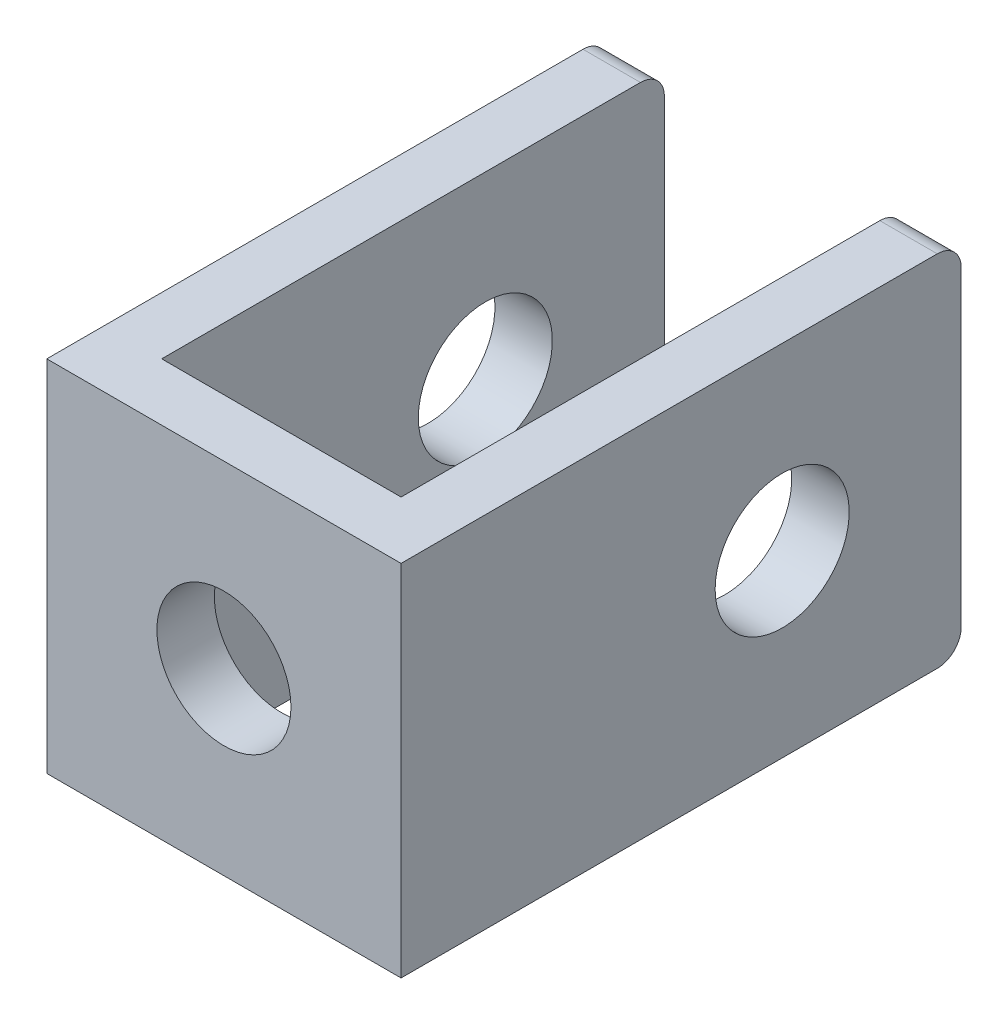
ISO-10303-21;
HEADER;
FILE_DESCRIPTION(('STEP AP214'),'2;1');
FILE_NAME('part.step','',(''),(''),'','','');
FILE_SCHEMA(('AUTOMOTIVE_DESIGN { 1 0 10303 214 1 1 1 1 }'));
ENDSEC;
DATA;
#1=APPLICATION_CONTEXT('core data for automotive mechanical design processes');
#2=APPLICATION_PROTOCOL_DEFINITION('international standard','automotive_design',2000,#1);
#3=PRODUCT_CONTEXT('',#1,'mechanical');
#4=PRODUCT('Part','Part','',(#3));
#5=PRODUCT_RELATED_PRODUCT_CATEGORY('part','',(#4));
#6=PRODUCT_DEFINITION_FORMATION('','',#4);
#7=PRODUCT_DEFINITION_CONTEXT('part definition',#1,'design');
#8=PRODUCT_DEFINITION('design','',#6,#7);
#9=PRODUCT_DEFINITION_SHAPE('','',#8);
#10=(LENGTH_UNIT() NAMED_UNIT(*) SI_UNIT(.MILLI.,.METRE.));
#11=(NAMED_UNIT(*) PLANE_ANGLE_UNIT() SI_UNIT($,.RADIAN.));
#12=(NAMED_UNIT(*) SI_UNIT($,.STERADIAN.) SOLID_ANGLE_UNIT());
#13=UNCERTAINTY_MEASURE_WITH_UNIT(LENGTH_MEASURE(1.E-05),#10,'distance_accuracy_value','');
#14=(GEOMETRIC_REPRESENTATION_CONTEXT(3) GLOBAL_UNCERTAINTY_ASSIGNED_CONTEXT((#13)) GLOBAL_UNIT_ASSIGNED_CONTEXT((#10,
#11,#12)) REPRESENTATION_CONTEXT('',''));
#15=CARTESIAN_POINT('',(0.,0.,0.));
#16=DIRECTION('',(0.,0.,1.));
#17=DIRECTION('',(1.,0.,0.));
#18=AXIS2_PLACEMENT_3D('',#15,#16,#17);
#19=CARTESIAN_POINT('',(-4.699,0.,-7.4295));
#20=DIRECTION('',(0.,0.,-1.));
#21=DIRECTION('',(-1.,0.,0.));
#22=AXIS2_PLACEMENT_3D('',#19,#20,#21);
#23=PLANE('',#22);
#24=DIRECTION('',(0.,-1.,0.));
#25=VECTOR('',#24,1.);
#26=CARTESIAN_POINT('',(-3.175,9.525,-7.4295));
#27=LINE('',#26,#25);
#28=CARTESIAN_POINT('',(-3.175,8.89,-7.4295));
#29=VERTEX_POINT('',#28);
#30=CARTESIAN_POINT('',(-3.175,0.635000000000004,-7.4295));
#31=VERTEX_POINT('',#30);
#32=EDGE_CURVE('E148',#29,#31,#27,.T.);
#33=ORIENTED_EDGE('',*,*,#32,.T.);
#34=DIRECTION('',(1.,0.,0.));
#35=VECTOR('',#34,1.);
#36=CARTESIAN_POINT('',(-4.699,0.635,-7.4295));
#37=LINE('',#36,#35);
#38=CARTESIAN_POINT('',(-4.699,0.635,-7.4295));
#39=VERTEX_POINT('',#38);
#40=EDGE_CURVE('E202',#31,#39,#37,.F.);
#41=ORIENTED_EDGE('',*,*,#40,.T.);
#42=DIRECTION('',(0.,1.,0.));
#43=VECTOR('',#42,1.);
#44=CARTESIAN_POINT('',(-4.699,0.,-7.4295));
#45=LINE('',#44,#43);
#46=CARTESIAN_POINT('',(-4.699,8.89,-7.4295));
#47=VERTEX_POINT('',#46);
#48=EDGE_CURVE('E172',#39,#47,#45,.T.);
#49=ORIENTED_EDGE('',*,*,#48,.T.);
#50=DIRECTION('',(1.,0.,0.));
#51=VECTOR('',#50,1.);
#52=CARTESIAN_POINT('',(-4.699,8.89,-7.4295));
#53=LINE('',#52,#51);
#54=EDGE_CURVE('E199',#47,#29,#53,.T.);
#55=ORIENTED_EDGE('',*,*,#54,.T.);
#56=EDGE_LOOP('',(#33,#41,#49,#55));
#57=FACE_BOUND('',#56,.T.);
#58=ADVANCED_FACE('F33',(#57),#23,.T.);
#59=CARTESIAN_POINT('',(-4.699,9.525,7.4295));
#60=DIRECTION('',(0.,0.,1.));
#61=DIRECTION('',(1.,0.,0.));
#62=AXIS2_PLACEMENT_3D('',#59,#60,#61);
#63=PLANE('',#62);
#64=CARTESIAN_POINT('',(0.,4.7625,7.4295));
#65=DIRECTION('',(0.,0.,1.));
#66=DIRECTION('',(1.,0.,0.));
#67=AXIS2_PLACEMENT_3D('',#64,#65,#66);
#68=CIRCLE('',#67,1.77799999999998);
#69=CARTESIAN_POINT('',(1.77799999999998,4.7625,7.4295));
#70=VERTEX_POINT('',#69);
#71=EDGE_CURVE('E300',#70,#70,#68,.T.);
#72=ORIENTED_EDGE('',*,*,#71,.F.);
#73=EDGE_LOOP('',(#72));
#74=FACE_BOUND('',#73,.T.);
#75=DIRECTION('',(0.,-1.,0.));
#76=VECTOR('',#75,1.);
#77=CARTESIAN_POINT('',(4.699,9.525,7.4295));
#78=LINE('',#77,#76);
#79=CARTESIAN_POINT('',(4.699,9.525,7.4295));
#80=VERTEX_POINT('',#79);
#81=CARTESIAN_POINT('',(4.699,0.,7.4295));
#82=VERTEX_POINT('',#81);
#83=EDGE_CURVE('E161',#80,#82,#78,.T.);
#84=ORIENTED_EDGE('',*,*,#83,.F.);
#85=DIRECTION('',(1.,0.,0.));
#86=VECTOR('',#85,1.);
#87=CARTESIAN_POINT('',(-4.699,9.525,7.4295));
#88=LINE('',#87,#86);
#89=CARTESIAN_POINT('',(-4.699,9.525,7.4295));
#90=VERTEX_POINT('',#89);
#91=EDGE_CURVE('E185',#90,#80,#88,.T.);
#92=ORIENTED_EDGE('',*,*,#91,.F.);
#93=DIRECTION('',(0.,-1.,0.));
#94=VECTOR('',#93,1.);
#95=CARTESIAN_POINT('',(-4.699,9.525,7.4295));
#96=LINE('',#95,#94);
#97=CARTESIAN_POINT('',(-4.699,0.,7.4295));
#98=VERTEX_POINT('',#97);
#99=EDGE_CURVE('E165',#90,#98,#96,.T.);
#100=ORIENTED_EDGE('',*,*,#99,.T.);
#101=DIRECTION('',(1.,0.,0.));
#102=VECTOR('',#101,1.);
#103=CARTESIAN_POINT('',(-4.699,0.,7.4295));
#104=LINE('',#103,#102);
#105=EDGE_CURVE('E177',#98,#82,#104,.T.);
#106=ORIENTED_EDGE('',*,*,#105,.T.);
#107=EDGE_LOOP('',(#84,#92,#100,#106));
#108=FACE_BOUND('',#107,.T.);
#109=ADVANCED_FACE('F241',(#74,#108),#63,.T.);
#110=CARTESIAN_POINT('',(-4.699,9.525,-7.4295));
#111=DIRECTION('',(0.,1.,0.));
#112=DIRECTION('',(0.,0.,1.));
#113=AXIS2_PLACEMENT_3D('',#110,#111,#112);
#114=PLANE('',#113);
#115=DIRECTION('',(0.,0.,-1.));
#116=VECTOR('',#115,1.);
#117=CARTESIAN_POINT('',(-3.175,9.525,5.9055));
#118=LINE('',#117,#116);
#119=CARTESIAN_POINT('',(-3.175,9.525,5.9055));
#120=VERTEX_POINT('',#119);
#121=CARTESIAN_POINT('',(-3.175,9.525,-6.7945));
#122=VERTEX_POINT('',#121);
#123=EDGE_CURVE('E133',#120,#122,#118,.T.);
#124=ORIENTED_EDGE('',*,*,#123,.T.);
#125=DIRECTION('',(1.,0.,0.));
#126=VECTOR('',#125,1.);
#127=CARTESIAN_POINT('',(-4.699,9.525,-6.7945));
#128=LINE('',#127,#126);
#129=CARTESIAN_POINT('',(-4.699,9.525,-6.7945));
#130=VERTEX_POINT('',#129);
#131=EDGE_CURVE('E209',#122,#130,#128,.F.);
#132=ORIENTED_EDGE('',*,*,#131,.T.);
#133=DIRECTION('',(0.,0.,1.));
#134=VECTOR('',#133,1.);
#135=CARTESIAN_POINT('',(-4.699,9.525,-7.4295));
#136=LINE('',#135,#134);
#137=EDGE_CURVE('E175',#130,#90,#136,.T.);
#138=ORIENTED_EDGE('',*,*,#137,.T.);
#139=ORIENTED_EDGE('',*,*,#91,.T.);
#140=DIRECTION('',(0.,0.,1.));
#141=VECTOR('',#140,1.);
#142=CARTESIAN_POINT('',(4.699,9.525,-7.4295));
#143=LINE('',#142,#141);
#144=CARTESIAN_POINT('',(4.699,9.525,-6.7945));
#145=VERTEX_POINT('',#144);
#146=EDGE_CURVE('E169',#145,#80,#143,.T.);
#147=ORIENTED_EDGE('',*,*,#146,.F.);
#148=DIRECTION('',(1.,0.,0.));
#149=VECTOR('',#148,1.);
#150=CARTESIAN_POINT('',(-4.699,9.525,-6.7945));
#151=LINE('',#150,#149);
#152=CARTESIAN_POINT('',(3.175,9.525,-6.7945));
#153=VERTEX_POINT('',#152);
#154=EDGE_CURVE('E130',#145,#153,#151,.F.);
#155=ORIENTED_EDGE('',*,*,#154,.T.);
#156=DIRECTION('',(0.,0.,1.));
#157=VECTOR('',#156,1.);
#158=CARTESIAN_POINT('',(3.175,9.525,-7.4295));
#159=LINE('',#158,#157);
#160=CARTESIAN_POINT('',(3.175,9.525,5.9055));
#161=VERTEX_POINT('',#160);
#162=EDGE_CURVE('E123',#153,#161,#159,.T.);
#163=ORIENTED_EDGE('',*,*,#162,.T.);
#164=DIRECTION('',(-1.,0.,0.));
#165=VECTOR('',#164,1.);
#166=CARTESIAN_POINT('',(3.175,9.525,5.9055));
#167=LINE('',#166,#165);
#168=EDGE_CURVE('E128',#161,#120,#167,.T.);
#169=ORIENTED_EDGE('',*,*,#168,.T.);
#170=EDGE_LOOP('',(#124,#132,#138,#139,#147,#155,#163,#169));
#171=FACE_BOUND('',#170,.T.);
#172=ADVANCED_FACE('F126',(#171),#114,.T.);
#173=DIRECTION('',(0.,-1.,0.));
#174=VECTOR('',#173,1.);
#175=CARTESIAN_POINT('',(3.175,9.525,-7.4295));
#176=LINE('',#175,#174);
#177=CARTESIAN_POINT('',(3.175,8.89,-7.4295));
#178=VERTEX_POINT('',#177);
#179=CARTESIAN_POINT('',(3.175,0.635000000000004,-7.4295));
#180=VERTEX_POINT('',#179);
#181=EDGE_CURVE('E144',#178,#180,#176,.T.);
#182=ORIENTED_EDGE('',*,*,#181,.F.);
#183=DIRECTION('',(1.,0.,0.));
#184=VECTOR('',#183,1.);
#185=CARTESIAN_POINT('',(-4.699,8.89,-7.4295));
#186=LINE('',#185,#184);
#187=CARTESIAN_POINT('',(4.699,8.89,-7.4295));
#188=VERTEX_POINT('',#187);
#189=EDGE_CURVE('E213',#178,#188,#186,.T.);
#190=ORIENTED_EDGE('',*,*,#189,.T.);
#191=DIRECTION('',(0.,1.,0.));
#192=VECTOR('',#191,1.);
#193=CARTESIAN_POINT('',(4.699,0.,-7.4295));
#194=LINE('',#193,#192);
#195=CARTESIAN_POINT('',(4.699,0.635,-7.4295));
#196=VERTEX_POINT('',#195);
#197=EDGE_CURVE('E182',#196,#188,#194,.T.);
#198=ORIENTED_EDGE('',*,*,#197,.F.);
#199=DIRECTION('',(1.,0.,0.));
#200=VECTOR('',#199,1.);
#201=CARTESIAN_POINT('',(-4.699,0.635,-7.4295));
#202=LINE('',#201,#200);
#203=EDGE_CURVE('E211',#196,#180,#202,.F.);
#204=ORIENTED_EDGE('',*,*,#203,.T.);
#205=EDGE_LOOP('',(#182,#190,#198,#204));
#206=FACE_BOUND('',#205,.T.);
#207=ADVANCED_FACE('F226',(#206),#23,.T.);
#208=CARTESIAN_POINT('',(-4.699,0.,7.4295));
#209=DIRECTION('',(0.,-1.,0.));
#210=DIRECTION('',(0.,0.,-1.));
#211=AXIS2_PLACEMENT_3D('',#208,#209,#210);
#212=PLANE('',#211);
#213=DIRECTION('',(0.,0.,-1.));
#214=VECTOR('',#213,1.);
#215=CARTESIAN_POINT('',(-4.699,0.,7.4295));
#216=LINE('',#215,#214);
#217=CARTESIAN_POINT('',(-4.699,0.,-6.7945));
#218=VERTEX_POINT('',#217);
#219=EDGE_CURVE('E168',#98,#218,#216,.T.);
#220=ORIENTED_EDGE('',*,*,#219,.T.);
#221=DIRECTION('',(1.,0.,0.));
#222=VECTOR('',#221,1.);
#223=CARTESIAN_POINT('',(-4.699,0.,-6.7945));
#224=LINE('',#223,#222);
#225=CARTESIAN_POINT('',(-3.175,0.,-6.7945));
#226=VERTEX_POINT('',#225);
#227=EDGE_CURVE('E192',#218,#226,#224,.T.);
#228=ORIENTED_EDGE('',*,*,#227,.T.);
#229=DIRECTION('',(0.,0.,-1.));
#230=VECTOR('',#229,1.);
#231=CARTESIAN_POINT('',(-3.175,0.,5.9055));
#232=LINE('',#231,#230);
#233=CARTESIAN_POINT('',(-3.175,0.,5.9055));
#234=VERTEX_POINT('',#233);
#235=EDGE_CURVE('E154',#234,#226,#232,.T.);
#236=ORIENTED_EDGE('',*,*,#235,.F.);
#237=DIRECTION('',(-1.,0.,0.));
#238=VECTOR('',#237,1.);
#239=CARTESIAN_POINT('',(3.175,0.,5.9055));
#240=LINE('',#239,#238);
#241=CARTESIAN_POINT('',(3.175,0.,5.9055));
#242=VERTEX_POINT('',#241);
#243=EDGE_CURVE('E159',#242,#234,#240,.T.);
#244=ORIENTED_EDGE('',*,*,#243,.F.);
#245=DIRECTION('',(0.,0.,1.));
#246=VECTOR('',#245,1.);
#247=CARTESIAN_POINT('',(3.175,0.,-7.4295));
#248=LINE('',#247,#246);
#249=CARTESIAN_POINT('',(3.175,0.,-6.7945));
#250=VERTEX_POINT('',#249);
#251=EDGE_CURVE('E139',#250,#242,#248,.T.);
#252=ORIENTED_EDGE('',*,*,#251,.F.);
#253=DIRECTION('',(1.,0.,0.));
#254=VECTOR('',#253,1.);
#255=CARTESIAN_POINT('',(-4.699,0.,-6.7945));
#256=LINE('',#255,#254);
#257=CARTESIAN_POINT('',(4.699,0.,-6.7945));
#258=VERTEX_POINT('',#257);
#259=EDGE_CURVE('E188',#250,#258,#256,.T.);
#260=ORIENTED_EDGE('',*,*,#259,.T.);
#261=DIRECTION('',(0.,0.,-1.));
#262=VECTOR('',#261,1.);
#263=CARTESIAN_POINT('',(4.699,0.,7.4295));
#264=LINE('',#263,#262);
#265=EDGE_CURVE('E180',#82,#258,#264,.T.);
#266=ORIENTED_EDGE('',*,*,#265,.F.);
#267=ORIENTED_EDGE('',*,*,#105,.F.);
#268=EDGE_LOOP('',(#220,#228,#236,#244,#252,#260,#266,#267));
#269=FACE_BOUND('',#268,.T.);
#270=ADVANCED_FACE('F222',(#269),#212,.T.);
#271=CARTESIAN_POINT('',(-4.699,0.,0.));
#272=DIRECTION('',(1.,0.,0.));
#273=DIRECTION('',(0.,0.,-1.));
#274=AXIS2_PLACEMENT_3D('',#271,#272,#273);
#275=PLANE('',#274);
#276=CARTESIAN_POINT('',(-4.699,4.7625,-2.6797));
#277=DIRECTION('',(-1.,0.,0.));
#278=DIRECTION('',(0.,0.,1.));
#279=AXIS2_PLACEMENT_3D('',#276,#277,#278);
#280=CIRCLE('',#279,1.77799999999998);
#281=CARTESIAN_POINT('',(-4.699,4.7625,-0.901700000000018));
#282=VERTEX_POINT('',#281);
#283=EDGE_CURVE('E308',#282,#282,#280,.T.);
#284=ORIENTED_EDGE('',*,*,#283,.F.);
#285=EDGE_LOOP('',(#284));
#286=FACE_BOUND('',#285,.T.);
#287=ORIENTED_EDGE('',*,*,#48,.F.);
#288=CARTESIAN_POINT('',(-4.699,0.635,-6.7945));
#289=DIRECTION('',(1.,0.,0.));
#290=DIRECTION('',(0.,0.,-1.));
#291=AXIS2_PLACEMENT_3D('',#288,#289,#290);
#292=CIRCLE('',#291,0.635);
#293=EDGE_CURVE('E206',#39,#218,#292,.F.);
#294=ORIENTED_EDGE('',*,*,#293,.T.);
#295=ORIENTED_EDGE('',*,*,#219,.F.);
#296=ORIENTED_EDGE('',*,*,#99,.F.);
#297=ORIENTED_EDGE('',*,*,#137,.F.);
#298=CARTESIAN_POINT('',(-4.699,8.89,-6.7945));
#299=DIRECTION('',(1.,0.,0.));
#300=DIRECTION('',(0.,0.,-1.));
#301=AXIS2_PLACEMENT_3D('',#298,#299,#300);
#302=CIRCLE('',#301,0.635);
#303=EDGE_CURVE('E204',#130,#47,#302,.F.);
#304=ORIENTED_EDGE('',*,*,#303,.T.);
#305=EDGE_LOOP('',(#287,#294,#295,#296,#297,#304));
#306=FACE_BOUND('',#305,.T.);
#307=ADVANCED_FACE('F256',(#286,#306),#275,.F.);
#308=CARTESIAN_POINT('',(4.699,0.,0.));
#309=DIRECTION('',(1.,0.,0.));
#310=DIRECTION('',(0.,0.,-1.));
#311=AXIS2_PLACEMENT_3D('',#308,#309,#310);
#312=PLANE('',#311);
#313=CARTESIAN_POINT('',(4.699,4.7625,-2.6797));
#314=DIRECTION('',(-1.,0.,0.));
#315=DIRECTION('',(0.,0.,1.));
#316=AXIS2_PLACEMENT_3D('',#313,#314,#315);
#317=CIRCLE('',#316,1.77799999999998);
#318=CARTESIAN_POINT('',(4.699,4.7625,-0.901700000000019));
#319=VERTEX_POINT('',#318);
#320=EDGE_CURVE('E295',#319,#319,#317,.T.);
#321=ORIENTED_EDGE('',*,*,#320,.T.);
#322=EDGE_LOOP('',(#321));
#323=FACE_BOUND('',#322,.T.);
#324=ORIENTED_EDGE('',*,*,#197,.T.);
#325=CARTESIAN_POINT('',(4.699,8.89,-6.7945));
#326=DIRECTION('',(1.,0.,0.));
#327=DIRECTION('',(0.,0.,-1.));
#328=AXIS2_PLACEMENT_3D('',#325,#326,#327);
#329=CIRCLE('',#328,0.635);
#330=EDGE_CURVE('E48',#188,#145,#329,.T.);
#331=ORIENTED_EDGE('',*,*,#330,.T.);
#332=ORIENTED_EDGE('',*,*,#146,.T.);
#333=ORIENTED_EDGE('',*,*,#83,.T.);
#334=ORIENTED_EDGE('',*,*,#265,.T.);
#335=CARTESIAN_POINT('',(4.699,0.635,-6.7945));
#336=DIRECTION('',(1.,0.,0.));
#337=DIRECTION('',(0.,0.,-1.));
#338=AXIS2_PLACEMENT_3D('',#335,#336,#337);
#339=CIRCLE('',#338,0.635);
#340=EDGE_CURVE('E56',#258,#196,#339,.T.);
#341=ORIENTED_EDGE('',*,*,#340,.T.);
#342=EDGE_LOOP('',(#324,#331,#332,#333,#334,#341));
#343=FACE_BOUND('',#342,.T.);
#344=ADVANCED_FACE('F227',(#323,#343),#312,.T.);
#345=CARTESIAN_POINT('',(-3.175,9.525,5.9055));
#346=DIRECTION('',(-1.,0.,0.));
#347=DIRECTION('',(0.,0.,1.));
#348=AXIS2_PLACEMENT_3D('',#345,#346,#347);
#349=PLANE('',#348);
#350=CARTESIAN_POINT('',(-3.175,4.7625,-2.6797));
#351=DIRECTION('',(-1.,0.,0.));
#352=DIRECTION('',(0.,0.,1.));
#353=AXIS2_PLACEMENT_3D('',#350,#351,#352);
#354=CIRCLE('',#353,1.77799999999999);
#355=CARTESIAN_POINT('',(-3.175,4.7625,-0.901700000000012));
#356=VERTEX_POINT('',#355);
#357=EDGE_CURVE('E157',#356,#356,#354,.T.);
#358=ORIENTED_EDGE('',*,*,#357,.T.);
#359=EDGE_LOOP('',(#358));
#360=FACE_BOUND('',#359,.T.);
#361=ORIENTED_EDGE('',*,*,#235,.T.);
#362=CARTESIAN_POINT('',(-3.175,0.635,-6.7945));
#363=DIRECTION('',(-1.,0.,0.));
#364=DIRECTION('',(0.,0.,1.));
#365=AXIS2_PLACEMENT_3D('',#362,#363,#364);
#366=CIRCLE('',#365,0.635);
#367=EDGE_CURVE('E197',#226,#31,#366,.F.);
#368=ORIENTED_EDGE('',*,*,#367,.T.);
#369=ORIENTED_EDGE('',*,*,#32,.F.);
#370=CARTESIAN_POINT('',(-3.175,8.89,-6.7945));
#371=DIRECTION('',(-1.,0.,0.));
#372=DIRECTION('',(0.,0.,1.));
#373=AXIS2_PLACEMENT_3D('',#370,#371,#372);
#374=CIRCLE('',#373,0.635);
#375=EDGE_CURVE('E195',#29,#122,#374,.F.);
#376=ORIENTED_EDGE('',*,*,#375,.T.);
#377=ORIENTED_EDGE('',*,*,#123,.F.);
#378=DIRECTION('',(0.,-1.,0.));
#379=VECTOR('',#378,1.);
#380=CARTESIAN_POINT('',(-3.175,9.525,5.9055));
#381=LINE('',#380,#379);
#382=EDGE_CURVE('E143',#120,#234,#381,.T.);
#383=ORIENTED_EDGE('',*,*,#382,.T.);
#384=EDGE_LOOP('',(#361,#368,#369,#376,#377,#383));
#385=FACE_BOUND('',#384,.T.);
#386=ADVANCED_FACE('F262',(#360,#385),#349,.F.);
#387=CARTESIAN_POINT('',(3.175,9.525,5.9055));
#388=DIRECTION('',(0.,0.,1.));
#389=DIRECTION('',(1.,0.,0.));
#390=AXIS2_PLACEMENT_3D('',#387,#388,#389);
#391=PLANE('',#390);
#392=CARTESIAN_POINT('',(0.,4.7625,5.9055));
#393=DIRECTION('',(0.,0.,1.));
#394=DIRECTION('',(1.,0.,0.));
#395=AXIS2_PLACEMENT_3D('',#392,#393,#394);
#396=CIRCLE('',#395,1.77799999999998);
#397=CARTESIAN_POINT('',(1.77799999999998,4.7625,5.9055));
#398=VERTEX_POINT('',#397);
#399=EDGE_CURVE('E305',#398,#398,#396,.T.);
#400=ORIENTED_EDGE('',*,*,#399,.T.);
#401=EDGE_LOOP('',(#400));
#402=FACE_BOUND('',#401,.T.);
#403=ORIENTED_EDGE('',*,*,#243,.T.);
#404=ORIENTED_EDGE('',*,*,#382,.F.);
#405=ORIENTED_EDGE('',*,*,#168,.F.);
#406=DIRECTION('',(0.,-1.,0.));
#407=VECTOR('',#406,1.);
#408=CARTESIAN_POINT('',(3.175,9.525,5.9055));
#409=LINE('',#408,#407);
#410=EDGE_CURVE('E136',#161,#242,#409,.T.);
#411=ORIENTED_EDGE('',*,*,#410,.T.);
#412=EDGE_LOOP('',(#403,#404,#405,#411));
#413=FACE_BOUND('',#412,.T.);
#414=ADVANCED_FACE('F146',(#402,#413),#391,.F.);
#415=CARTESIAN_POINT('',(3.175,9.525,-7.4295));
#416=DIRECTION('',(1.,0.,0.));
#417=DIRECTION('',(0.,0.,-1.));
#418=AXIS2_PLACEMENT_3D('',#415,#416,#417);
#419=PLANE('',#418);
#420=CARTESIAN_POINT('',(3.175,4.7625,-2.6797));
#421=DIRECTION('',(-1.,0.,0.));
#422=DIRECTION('',(0.,0.,1.));
#423=AXIS2_PLACEMENT_3D('',#420,#421,#422);
#424=CIRCLE('',#423,1.77799999999998);
#425=CARTESIAN_POINT('',(3.175,4.7625,-0.901700000000018));
#426=VERTEX_POINT('',#425);
#427=EDGE_CURVE('E298',#426,#426,#424,.T.);
#428=ORIENTED_EDGE('',*,*,#427,.F.);
#429=EDGE_LOOP('',(#428));
#430=FACE_BOUND('',#429,.T.);
#431=ORIENTED_EDGE('',*,*,#162,.F.);
#432=CARTESIAN_POINT('',(3.175,8.89,-6.7945));
#433=DIRECTION('',(1.,0.,0.));
#434=DIRECTION('',(0.,0.,-1.));
#435=AXIS2_PLACEMENT_3D('',#432,#433,#434);
#436=CIRCLE('',#435,0.635);
#437=EDGE_CURVE('E11',#153,#178,#436,.F.);
#438=ORIENTED_EDGE('',*,*,#437,.T.);
#439=ORIENTED_EDGE('',*,*,#181,.T.);
#440=CARTESIAN_POINT('',(3.175,0.635,-6.7945));
#441=DIRECTION('',(1.,0.,0.));
#442=DIRECTION('',(0.,0.,-1.));
#443=AXIS2_PLACEMENT_3D('',#440,#441,#442);
#444=CIRCLE('',#443,0.635);
#445=EDGE_CURVE('E41',#180,#250,#444,.F.);
#446=ORIENTED_EDGE('',*,*,#445,.T.);
#447=ORIENTED_EDGE('',*,*,#251,.T.);
#448=ORIENTED_EDGE('',*,*,#410,.F.);
#449=EDGE_LOOP('',(#431,#438,#439,#446,#447,#448));
#450=FACE_BOUND('',#449,.T.);
#451=ADVANCED_FACE('F137',(#430,#450),#419,.F.);
#452=CARTESIAN_POINT('',(-4.699,4.7625,-2.6797));
#453=DIRECTION('',(-1.,0.,0.));
#454=DIRECTION('',(0.,0.,1.));
#455=AXIS2_PLACEMENT_3D('',#452,#453,#454);
#456=CYLINDRICAL_SURFACE('',#455,1.77799999999999);
#457=ORIENTED_EDGE('',*,*,#357,.F.);
#458=EDGE_LOOP('',(#457));
#459=FACE_BOUND('',#458,.T.);
#460=ORIENTED_EDGE('',*,*,#283,.T.);
#461=EDGE_LOOP('',(#460));
#462=FACE_BOUND('',#461,.T.);
#463=ADVANCED_FACE('F272',(#459,#462),#456,.F.);
#464=CARTESIAN_POINT('',(0.,4.7625,7.4295));
#465=DIRECTION('',(0.,0.,1.));
#466=DIRECTION('',(1.,0.,0.));
#467=AXIS2_PLACEMENT_3D('',#464,#465,#466);
#468=CYLINDRICAL_SURFACE('',#467,1.77799999999998);
#469=ORIENTED_EDGE('',*,*,#71,.T.);
#470=EDGE_LOOP('',(#469));
#471=FACE_BOUND('',#470,.T.);
#472=ORIENTED_EDGE('',*,*,#399,.F.);
#473=EDGE_LOOP('',(#472));
#474=FACE_BOUND('',#473,.T.);
#475=ADVANCED_FACE('F279',(#471,#474),#468,.F.);
#476=CARTESIAN_POINT('',(3.175,4.7625,-2.6797));
#477=DIRECTION('',(-1.,0.,0.));
#478=DIRECTION('',(0.,0.,1.));
#479=AXIS2_PLACEMENT_3D('',#476,#477,#478);
#480=CYLINDRICAL_SURFACE('',#479,1.77799999999998);
#481=ORIENTED_EDGE('',*,*,#320,.F.);
#482=EDGE_LOOP('',(#481));
#483=FACE_BOUND('',#482,.T.);
#484=ORIENTED_EDGE('',*,*,#427,.T.);
#485=EDGE_LOOP('',(#484));
#486=FACE_BOUND('',#485,.T.);
#487=ADVANCED_FACE('F283',(#483,#486),#480,.F.);
#488=CARTESIAN_POINT('',(-4.699,0.635,-6.7945));
#489=DIRECTION('',(1.,0.,0.));
#490=DIRECTION('',(0.,0.,-1.));
#491=AXIS2_PLACEMENT_3D('',#488,#489,#490);
#492=CYLINDRICAL_SURFACE('',#491,0.635);
#493=ORIENTED_EDGE('',*,*,#293,.F.);
#494=ORIENTED_EDGE('',*,*,#40,.F.);
#495=ORIENTED_EDGE('',*,*,#367,.F.);
#496=ORIENTED_EDGE('',*,*,#227,.F.);
#497=EDGE_LOOP('',(#493,#494,#495,#496));
#498=FACE_BOUND('',#497,.T.);
#499=ADVANCED_FACE('F237',(#498),#492,.T.);
#500=CARTESIAN_POINT('',(-4.699,8.89,-6.7945));
#501=DIRECTION('',(1.,0.,0.));
#502=DIRECTION('',(0.,0.,-1.));
#503=AXIS2_PLACEMENT_3D('',#500,#501,#502);
#504=CYLINDRICAL_SURFACE('',#503,0.635);
#505=ORIENTED_EDGE('',*,*,#303,.F.);
#506=ORIENTED_EDGE('',*,*,#131,.F.);
#507=ORIENTED_EDGE('',*,*,#375,.F.);
#508=ORIENTED_EDGE('',*,*,#54,.F.);
#509=EDGE_LOOP('',(#505,#506,#507,#508));
#510=FACE_BOUND('',#509,.T.);
#511=ADVANCED_FACE('F232',(#510),#504,.T.);
#512=CARTESIAN_POINT('',(-4.699,8.89,-6.7945));
#513=DIRECTION('',(1.,0.,0.));
#514=DIRECTION('',(0.,0.,-1.));
#515=AXIS2_PLACEMENT_3D('',#512,#513,#514);
#516=CYLINDRICAL_SURFACE('',#515,0.635);
#517=ORIENTED_EDGE('',*,*,#437,.F.);
#518=ORIENTED_EDGE('',*,*,#154,.F.);
#519=ORIENTED_EDGE('',*,*,#330,.F.);
#520=ORIENTED_EDGE('',*,*,#189,.F.);
#521=EDGE_LOOP('',(#517,#518,#519,#520));
#522=FACE_BOUND('',#521,.T.);
#523=ADVANCED_FACE('F230',(#522),#516,.T.);
#524=CARTESIAN_POINT('',(-4.699,0.635,-6.7945));
#525=DIRECTION('',(1.,0.,0.));
#526=DIRECTION('',(0.,0.,-1.));
#527=AXIS2_PLACEMENT_3D('',#524,#525,#526);
#528=CYLINDRICAL_SURFACE('',#527,0.635);
#529=ORIENTED_EDGE('',*,*,#445,.F.);
#530=ORIENTED_EDGE('',*,*,#203,.F.);
#531=ORIENTED_EDGE('',*,*,#340,.F.);
#532=ORIENTED_EDGE('',*,*,#259,.F.);
#533=EDGE_LOOP('',(#529,#530,#531,#532));
#534=FACE_BOUND('',#533,.T.);
#535=ADVANCED_FACE('F35',(#534),#528,.T.);
#536=CLOSED_SHELL('',(#58,#109,#172,#207,#270,#307,#344,#386,#414,#451,#463,#475,#487,#499,#511,
#523,#535));
#537=MANIFOLD_SOLID_BREP('B2',#536);
#538=ADVANCED_BREP_SHAPE_REPRESENTATION('',(#18,#537),#14);
#539=SHAPE_DEFINITION_REPRESENTATION(#9,#538);
ENDSEC;
END-ISO-10303-21;
